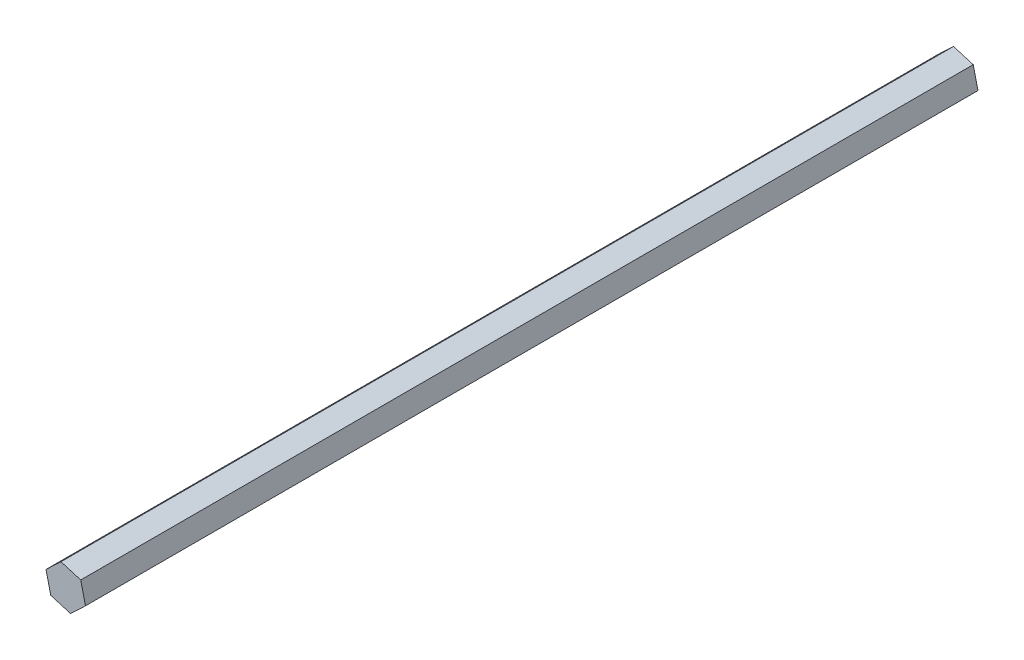
ISO-10303-21;
HEADER;
FILE_DESCRIPTION(('STEP AP214'),'2;1');
FILE_NAME('part.step','',(''),(''),'','','');
FILE_SCHEMA(('AUTOMOTIVE_DESIGN { 1 0 10303 214 1 1 1 1 }'));
ENDSEC;
DATA;
#1=APPLICATION_CONTEXT('core data for automotive mechanical design processes');
#2=APPLICATION_PROTOCOL_DEFINITION('international standard','automotive_design',2000,#1);
#3=PRODUCT_CONTEXT('',#1,'mechanical');
#4=PRODUCT('Part','Part','',(#3));
#5=PRODUCT_RELATED_PRODUCT_CATEGORY('part','',(#4));
#6=PRODUCT_DEFINITION_FORMATION('','',#4);
#7=PRODUCT_DEFINITION_CONTEXT('part definition',#1,'design');
#8=PRODUCT_DEFINITION('design','',#6,#7);
#9=PRODUCT_DEFINITION_SHAPE('','',#8);
#10=(LENGTH_UNIT() NAMED_UNIT(*) SI_UNIT(.MILLI.,.METRE.));
#11=(NAMED_UNIT(*) PLANE_ANGLE_UNIT() SI_UNIT($,.RADIAN.));
#12=(NAMED_UNIT(*) SI_UNIT($,.STERADIAN.) SOLID_ANGLE_UNIT());
#13=UNCERTAINTY_MEASURE_WITH_UNIT(LENGTH_MEASURE(1.E-05),#10,'distance_accuracy_value','');
#14=(GEOMETRIC_REPRESENTATION_CONTEXT(3) GLOBAL_UNCERTAINTY_ASSIGNED_CONTEXT((#13)) GLOBAL_UNIT_ASSIGNED_CONTEXT((#10,
#11,#12)) REPRESENTATION_CONTEXT('',''));
#15=CARTESIAN_POINT('',(0.,0.,0.));
#16=DIRECTION('',(0.,0.,1.));
#17=DIRECTION('',(1.,0.,0.));
#18=AXIS2_PLACEMENT_3D('',#15,#16,#17);
#19=CARTESIAN_POINT('',(7.02541630405898,-2.09925203060412,317.5));
#20=DIRECTION('',(-0.97292362547541,-0.231126846107896,0.));
#21=DIRECTION('',(0.231126846107896,-0.972923625475411,0.));
#22=AXIS2_PLACEMENT_3D('',#19,#20,#21);
#23=PLANE('',#22);
#24=DIRECTION('',(-0.231126846107896,0.972923625475411,0.));
#25=VECTOR('',#24,1.);
#26=CARTESIAN_POINT('',(7.02541630405898,-2.09925203060412,0.));
#27=LINE('',#26,#25);
#28=CARTESIAN_POINT('',(7.02541630405898,-2.09925203060412,0.));
#29=VERTEX_POINT('',#28);
#30=CARTESIAN_POINT('',(5.33071373947873,5.0345629761744,0.));
#31=VERTEX_POINT('',#30);
#32=EDGE_CURVE('E128',#29,#31,#27,.T.);
#33=ORIENTED_EDGE('',*,*,#32,.T.);
#34=DIRECTION('',(0.,0.,-1.));
#35=VECTOR('',#34,1.);
#36=CARTESIAN_POINT('',(5.33071373947873,5.0345629761744,317.5));
#37=LINE('',#36,#35);
#38=CARTESIAN_POINT('',(5.33071373947873,5.0345629761744,317.5));
#39=VERTEX_POINT('',#38);
#40=EDGE_CURVE('E11',#39,#31,#37,.T.);
#41=ORIENTED_EDGE('',*,*,#40,.F.);
#42=DIRECTION('',(-0.231126846107896,0.972923625475411,0.));
#43=VECTOR('',#42,1.);
#44=CARTESIAN_POINT('',(7.02541630405898,-2.09925203060412,317.5));
#45=LINE('',#44,#43);
#46=CARTESIAN_POINT('',(7.02541630405898,-2.09925203060412,317.5));
#47=VERTEX_POINT('',#46);
#48=EDGE_CURVE('E144',#47,#39,#45,.T.);
#49=ORIENTED_EDGE('',*,*,#48,.F.);
#50=DIRECTION('',(0.,0.,-1.));
#51=VECTOR('',#50,1.);
#52=CARTESIAN_POINT('',(7.02541630405898,-2.09925203060412,317.5));
#53=LINE('',#52,#51);
#54=EDGE_CURVE('E124',#47,#29,#53,.T.);
#55=ORIENTED_EDGE('',*,*,#54,.T.);
#56=EDGE_LOOP('',(#33,#41,#49,#55));
#57=FACE_BOUND('',#56,.T.);
#58=ADVANCED_FACE('F39',(#57),#23,.F.);
#59=CARTESIAN_POINT('',(5.33071373947873,5.0345629761744,317.5));
#60=DIRECTION('',(-0.286300092511691,-0.95813999865771,0.));
#61=DIRECTION('',(0.95813999865771,-0.286300092511691,0.));
#62=AXIS2_PLACEMENT_3D('',#59,#60,#61);
#63=PLANE('',#62);
#64=DIRECTION('',(-0.95813999865771,0.286300092511691,0.));
#65=VECTOR('',#64,1.);
#66=CARTESIAN_POINT('',(5.33071373947873,5.0345629761744,0.));
#67=LINE('',#66,#65);
#68=CARTESIAN_POINT('',(-1.69470256458026,7.13381500677852,0.));
#69=VERTEX_POINT('',#68);
#70=EDGE_CURVE('E132',#31,#69,#67,.T.);
#71=ORIENTED_EDGE('',*,*,#70,.T.);
#72=DIRECTION('',(0.,0.,-1.));
#73=VECTOR('',#72,1.);
#74=CARTESIAN_POINT('',(-1.69470256458026,7.13381500677852,317.5));
#75=LINE('',#74,#73);
#76=CARTESIAN_POINT('',(-1.69470256458026,7.13381500677852,317.5));
#77=VERTEX_POINT('',#76);
#78=EDGE_CURVE('E48',#77,#69,#75,.T.);
#79=ORIENTED_EDGE('',*,*,#78,.F.);
#80=DIRECTION('',(-0.95813999865771,0.286300092511691,0.));
#81=VECTOR('',#80,1.);
#82=CARTESIAN_POINT('',(5.33071373947873,5.0345629761744,317.5));
#83=LINE('',#82,#81);
#84=EDGE_CURVE('E93',#39,#77,#83,.T.);
#85=ORIENTED_EDGE('',*,*,#84,.F.);
#86=ORIENTED_EDGE('',*,*,#40,.T.);
#87=EDGE_LOOP('',(#71,#79,#85,#86));
#88=FACE_BOUND('',#87,.T.);
#89=ADVANCED_FACE('F172',(#88),#63,.F.);
#90=CARTESIAN_POINT('',(-1.69470256458026,7.13381500677852,317.5));
#91=DIRECTION('',(0.686623532963719,-0.727013152549814,0.));
#92=DIRECTION('',(0.727013152549815,0.68662353296372,0.));
#93=AXIS2_PLACEMENT_3D('',#90,#91,#92);
#94=PLANE('',#93);
#95=DIRECTION('',(-0.727013152549814,-0.68662353296372,0.));
#96=VECTOR('',#95,1.);
#97=CARTESIAN_POINT('',(-1.69470256458026,7.13381500677852,0.));
#98=LINE('',#97,#96);
#99=CARTESIAN_POINT('',(-7.02541630405899,2.09925203060412,0.));
#100=VERTEX_POINT('',#99);
#101=EDGE_CURVE('E135',#69,#100,#98,.T.);
#102=ORIENTED_EDGE('',*,*,#101,.T.);
#103=DIRECTION('',(0.,0.,-1.));
#104=VECTOR('',#103,1.);
#105=CARTESIAN_POINT('',(-7.02541630405899,2.09925203060412,317.5));
#106=LINE('',#105,#104);
#107=CARTESIAN_POINT('',(-7.02541630405899,2.09925203060412,317.5));
#108=VERTEX_POINT('',#107);
#109=EDGE_CURVE('E117',#108,#100,#106,.T.);
#110=ORIENTED_EDGE('',*,*,#109,.F.);
#111=DIRECTION('',(-0.727013152549814,-0.68662353296372,0.));
#112=VECTOR('',#111,1.);
#113=CARTESIAN_POINT('',(-1.69470256458026,7.13381500677852,317.5));
#114=LINE('',#113,#112);
#115=EDGE_CURVE('E106',#77,#108,#114,.T.);
#116=ORIENTED_EDGE('',*,*,#115,.F.);
#117=ORIENTED_EDGE('',*,*,#78,.T.);
#118=EDGE_LOOP('',(#102,#110,#116,#117));
#119=FACE_BOUND('',#118,.T.);
#120=ADVANCED_FACE('F154',(#119),#94,.F.);
#121=CARTESIAN_POINT('',(-7.02541630405899,2.09925203060412,317.5));
#122=DIRECTION('',(0.972923625475411,0.231126846107896,0.));
#123=DIRECTION('',(-0.231126846107896,0.972923625475411,0.));
#124=AXIS2_PLACEMENT_3D('',#121,#122,#123);
#125=PLANE('',#124);
#126=DIRECTION('',(0.231126846107896,-0.97292362547541,0.));
#127=VECTOR('',#126,1.);
#128=CARTESIAN_POINT('',(-7.02541630405899,2.09925203060412,0.));
#129=LINE('',#128,#127);
#130=CARTESIAN_POINT('',(-5.33071373947873,-5.0345629761744,0.));
#131=VERTEX_POINT('',#130);
#132=EDGE_CURVE('E115',#100,#131,#129,.T.);
#133=ORIENTED_EDGE('',*,*,#132,.T.);
#134=DIRECTION('',(0.,0.,-1.));
#135=VECTOR('',#134,1.);
#136=CARTESIAN_POINT('',(-5.33071373947873,-5.0345629761744,317.5));
#137=LINE('',#136,#135);
#138=CARTESIAN_POINT('',(-5.33071373947873,-5.0345629761744,317.5));
#139=VERTEX_POINT('',#138);
#140=EDGE_CURVE('E112',#139,#131,#137,.T.);
#141=ORIENTED_EDGE('',*,*,#140,.F.);
#142=DIRECTION('',(0.231126846107896,-0.97292362547541,0.));
#143=VECTOR('',#142,1.);
#144=CARTESIAN_POINT('',(-7.02541630405899,2.09925203060412,317.5));
#145=LINE('',#144,#143);
#146=EDGE_CURVE('E100',#108,#139,#145,.T.);
#147=ORIENTED_EDGE('',*,*,#146,.F.);
#148=ORIENTED_EDGE('',*,*,#109,.T.);
#149=EDGE_LOOP('',(#133,#141,#147,#148));
#150=FACE_BOUND('',#149,.T.);
#151=ADVANCED_FACE('F113',(#150),#125,.F.);
#152=CARTESIAN_POINT('',(-5.33071373947873,-5.0345629761744,317.5));
#153=DIRECTION('',(0.286300092511691,0.95813999865771,0.));
#154=DIRECTION('',(-0.95813999865771,0.286300092511691,0.));
#155=AXIS2_PLACEMENT_3D('',#152,#153,#154);
#156=PLANE('',#155);
#157=DIRECTION('',(0.95813999865771,-0.286300092511691,0.));
#158=VECTOR('',#157,1.);
#159=CARTESIAN_POINT('',(-5.33071373947873,-5.0345629761744,0.));
#160=LINE('',#159,#158);
#161=CARTESIAN_POINT('',(1.69470256458026,-7.13381500677852,0.));
#162=VERTEX_POINT('',#161);
#163=EDGE_CURVE('E79',#131,#162,#160,.T.);
#164=ORIENTED_EDGE('',*,*,#163,.T.);
#165=DIRECTION('',(0.,0.,-1.));
#166=VECTOR('',#165,1.);
#167=CARTESIAN_POINT('',(1.69470256458026,-7.13381500677852,317.5));
#168=LINE('',#167,#166);
#169=CARTESIAN_POINT('',(1.69470256458026,-7.13381500677852,317.5));
#170=VERTEX_POINT('',#169);
#171=EDGE_CURVE('E118',#170,#162,#168,.T.);
#172=ORIENTED_EDGE('',*,*,#171,.F.);
#173=DIRECTION('',(0.95813999865771,-0.286300092511691,0.));
#174=VECTOR('',#173,1.);
#175=CARTESIAN_POINT('',(-5.33071373947873,-5.0345629761744,317.5));
#176=LINE('',#175,#174);
#177=EDGE_CURVE('E104',#139,#170,#176,.T.);
#178=ORIENTED_EDGE('',*,*,#177,.F.);
#179=ORIENTED_EDGE('',*,*,#140,.T.);
#180=EDGE_LOOP('',(#164,#172,#178,#179));
#181=FACE_BOUND('',#180,.T.);
#182=ADVANCED_FACE('F120',(#181),#156,.F.);
#183=CARTESIAN_POINT('',(1.69470256458026,-7.13381500677852,317.5));
#184=DIRECTION('',(-0.686623532963719,0.727013152549814,0.));
#185=DIRECTION('',(-0.727013152549814,-0.68662353296372,0.));
#186=AXIS2_PLACEMENT_3D('',#183,#184,#185);
#187=PLANE('',#186);
#188=DIRECTION('',(0.727013152549814,0.68662353296372,0.));
#189=VECTOR('',#188,1.);
#190=CARTESIAN_POINT('',(1.69470256458026,-7.13381500677852,0.));
#191=LINE('',#190,#189);
#192=EDGE_CURVE('E85',#162,#29,#191,.T.);
#193=ORIENTED_EDGE('',*,*,#192,.T.);
#194=ORIENTED_EDGE('',*,*,#54,.F.);
#195=DIRECTION('',(0.727013152549814,0.68662353296372,0.));
#196=VECTOR('',#195,1.);
#197=CARTESIAN_POINT('',(1.69470256458026,-7.13381500677852,317.5));
#198=LINE('',#197,#196);
#199=EDGE_CURVE('E56',#170,#47,#198,.T.);
#200=ORIENTED_EDGE('',*,*,#199,.F.);
#201=ORIENTED_EDGE('',*,*,#171,.T.);
#202=EDGE_LOOP('',(#193,#194,#200,#201));
#203=FACE_BOUND('',#202,.T.);
#204=ADVANCED_FACE('F161',(#203),#187,.F.);
#205=CARTESIAN_POINT('',(0.,0.,317.5));
#206=DIRECTION('',(0.,0.,1.));
#207=DIRECTION('',(1.,0.,0.));
#208=AXIS2_PLACEMENT_3D('',#205,#206,#207);
#209=PLANE('',#208);
#210=ORIENTED_EDGE('',*,*,#48,.T.);
#211=ORIENTED_EDGE('',*,*,#84,.T.);
#212=ORIENTED_EDGE('',*,*,#115,.T.);
#213=ORIENTED_EDGE('',*,*,#146,.T.);
#214=ORIENTED_EDGE('',*,*,#177,.T.);
#215=ORIENTED_EDGE('',*,*,#199,.T.);
#216=EDGE_LOOP('',(#210,#211,#212,#213,#214,#215));
#217=FACE_BOUND('',#216,.T.);
#218=ADVANCED_FACE('F102',(#217),#209,.T.);
#219=CARTESIAN_POINT('',(0.,0.,0.));
#220=DIRECTION('',(0.,0.,1.));
#221=DIRECTION('',(1.,0.,0.));
#222=AXIS2_PLACEMENT_3D('',#219,#220,#221);
#223=PLANE('',#222);
#224=ORIENTED_EDGE('',*,*,#32,.F.);
#225=ORIENTED_EDGE('',*,*,#192,.F.);
#226=ORIENTED_EDGE('',*,*,#163,.F.);
#227=ORIENTED_EDGE('',*,*,#132,.F.);
#228=ORIENTED_EDGE('',*,*,#101,.F.);
#229=ORIENTED_EDGE('',*,*,#70,.F.);
#230=EDGE_LOOP('',(#224,#225,#226,#227,#228,#229));
#231=FACE_BOUND('',#230,.T.);
#232=ADVANCED_FACE('F157',(#231),#223,.F.);
#233=CLOSED_SHELL('',(#58,#89,#120,#151,#182,#204,#218,#232));
#234=MANIFOLD_SOLID_BREP('B2',#233);
#235=ADVANCED_BREP_SHAPE_REPRESENTATION('',(#18,#234),#14);
#236=SHAPE_DEFINITION_REPRESENTATION(#9,#235);
ENDSEC;
END-ISO-10303-21;
